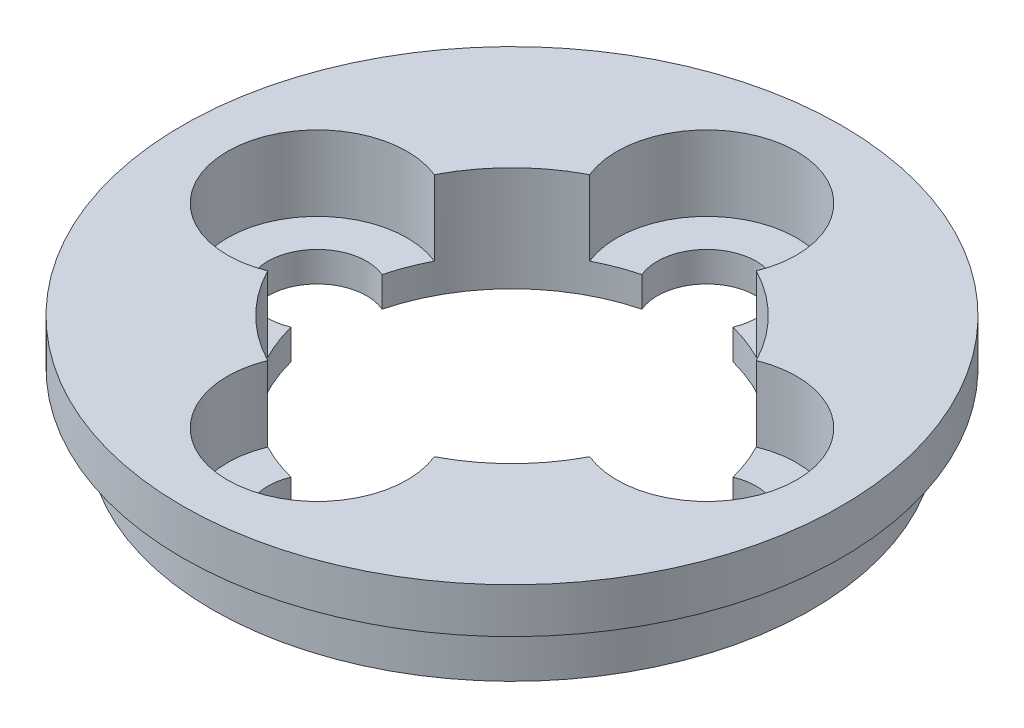
ISO-10303-21;
HEADER;
FILE_DESCRIPTION(('STEP AP214'),'2;1');
FILE_NAME('part.step','',(''),(''),'','','');
FILE_SCHEMA(('AUTOMOTIVE_DESIGN { 1 0 10303 214 1 1 1 1 }'));
ENDSEC;
DATA;
#1=APPLICATION_CONTEXT('core data for automotive mechanical design processes');
#2=APPLICATION_PROTOCOL_DEFINITION('international standard','automotive_design',2000,#1);
#3=PRODUCT_CONTEXT('',#1,'mechanical');
#4=PRODUCT('Part','Part','',(#3));
#5=PRODUCT_RELATED_PRODUCT_CATEGORY('part','',(#4));
#6=PRODUCT_DEFINITION_FORMATION('','',#4);
#7=PRODUCT_DEFINITION_CONTEXT('part definition',#1,'design');
#8=PRODUCT_DEFINITION('design','',#6,#7);
#9=PRODUCT_DEFINITION_SHAPE('','',#8);
#10=(LENGTH_UNIT() NAMED_UNIT(*) SI_UNIT(.MILLI.,.METRE.));
#11=(NAMED_UNIT(*) PLANE_ANGLE_UNIT() SI_UNIT($,.RADIAN.));
#12=(NAMED_UNIT(*) SI_UNIT($,.STERADIAN.) SOLID_ANGLE_UNIT());
#13=UNCERTAINTY_MEASURE_WITH_UNIT(LENGTH_MEASURE(1.E-05),#10,'distance_accuracy_value','');
#14=(GEOMETRIC_REPRESENTATION_CONTEXT(3) GLOBAL_UNCERTAINTY_ASSIGNED_CONTEXT((#13)) GLOBAL_UNIT_ASSIGNED_CONTEXT((#10,
#11,#12)) REPRESENTATION_CONTEXT('',''));
#15=CARTESIAN_POINT('',(0.,0.,0.));
#16=DIRECTION('',(0.,0.,1.));
#17=DIRECTION('',(1.,0.,0.));
#18=AXIS2_PLACEMENT_3D('',#15,#16,#17);
#19=CARTESIAN_POINT('',(0.,0.,-6.5));
#20=DIRECTION('',(0.,1.,0.));
#21=DIRECTION('',(0.,0.,1.));
#22=AXIS2_PLACEMENT_3D('',#19,#20,#21);
#23=CYLINDRICAL_SURFACE('',#22,1.65);
#24=CARTESIAN_POINT('',(0.,1.,-6.5));
#25=DIRECTION('',(0.,1.,0.));
#26=DIRECTION('',(0.,0.,1.));
#27=AXIS2_PLACEMENT_3D('',#24,#25,#26);
#28=CIRCLE('',#27,1.65);
#29=CARTESIAN_POINT('',(-1.51919785748194,1.,-5.85615384615383));
#30=VERTEX_POINT('',#29);
#31=CARTESIAN_POINT('',(1.51919785748181,1.,-5.85615384615386));
#32=VERTEX_POINT('',#31);
#33=EDGE_CURVE('E11',#30,#32,#28,.F.);
#34=ORIENTED_EDGE('',*,*,#33,.F.);
#35=DIRECTION('',(0.,1.,0.));
#36=VECTOR('',#35,1.);
#37=CARTESIAN_POINT('',(-1.51919785748194,1.,-5.85615384615383));
#38=LINE('',#37,#36);
#39=CARTESIAN_POINT('',(-1.51919785748194,0.,-5.85615384615383));
#40=VERTEX_POINT('',#39);
#41=EDGE_CURVE('E248',#30,#40,#38,.F.);
#42=ORIENTED_EDGE('',*,*,#41,.T.);
#43=CARTESIAN_POINT('',(0.,0.,-6.5));
#44=DIRECTION('',(0.,1.,0.));
#45=DIRECTION('',(-1.,0.,0.));
#46=AXIS2_PLACEMENT_3D('',#43,#44,#45);
#47=CIRCLE('',#46,1.65);
#48=CARTESIAN_POINT('',(1.51919785748181,0.,-5.85615384615386));
#49=VERTEX_POINT('',#48);
#50=EDGE_CURVE('E218',#49,#40,#47,.T.);
#51=ORIENTED_EDGE('',*,*,#50,.F.);
#52=DIRECTION('',(0.,1.,0.));
#53=VECTOR('',#52,1.);
#54=CARTESIAN_POINT('',(1.51919785748181,1.,-5.85615384615386));
#55=LINE('',#54,#53);
#56=EDGE_CURVE('E250',#49,#32,#55,.T.);
#57=ORIENTED_EDGE('',*,*,#56,.T.);
#58=EDGE_LOOP('',(#34,#42,#51,#57));
#59=FACE_BOUND('',#58,.T.);
#60=ADVANCED_FACE('F37',(#59),#23,.F.);
#61=CARTESIAN_POINT('',(6.5,0.,0.));
#62=DIRECTION('',(0.,1.,0.));
#63=DIRECTION('',(0.,0.,1.));
#64=AXIS2_PLACEMENT_3D('',#61,#62,#63);
#65=CYLINDRICAL_SURFACE('',#64,1.65);
#66=CARTESIAN_POINT('',(6.5,1.,0.));
#67=DIRECTION('',(0.,1.,0.));
#68=DIRECTION('',(0.,0.,1.));
#69=AXIS2_PLACEMENT_3D('',#66,#67,#68);
#70=CIRCLE('',#69,1.65);
#71=CARTESIAN_POINT('',(5.85615384615385,1.,-1.51919785748187));
#72=VERTEX_POINT('',#71);
#73=CARTESIAN_POINT('',(5.85615384615384,1.,1.51919785748187));
#74=VERTEX_POINT('',#73);
#75=EDGE_CURVE('E45',#72,#74,#70,.F.);
#76=ORIENTED_EDGE('',*,*,#75,.F.);
#77=DIRECTION('',(0.,1.,0.));
#78=VECTOR('',#77,1.);
#79=CARTESIAN_POINT('',(5.85615384615385,1.,-1.51919785748187));
#80=LINE('',#79,#78);
#81=CARTESIAN_POINT('',(5.85615384615385,0.,-1.51919785748187));
#82=VERTEX_POINT('',#81);
#83=EDGE_CURVE('E253',#72,#82,#80,.F.);
#84=ORIENTED_EDGE('',*,*,#83,.T.);
#85=CARTESIAN_POINT('',(6.5,0.,0.));
#86=DIRECTION('',(0.,1.,0.));
#87=DIRECTION('',(0.,0.,-1.));
#88=AXIS2_PLACEMENT_3D('',#85,#86,#87);
#89=CIRCLE('',#88,1.65);
#90=CARTESIAN_POINT('',(5.85615384615385,0.,1.51919785748187));
#91=VERTEX_POINT('',#90);
#92=EDGE_CURVE('E225',#91,#82,#89,.T.);
#93=ORIENTED_EDGE('',*,*,#92,.F.);
#94=DIRECTION('',(0.,1.,0.));
#95=VECTOR('',#94,1.);
#96=CARTESIAN_POINT('',(5.85615384615385,1.,1.51919785748187));
#97=LINE('',#96,#95);
#98=EDGE_CURVE('E255',#91,#74,#97,.T.);
#99=ORIENTED_EDGE('',*,*,#98,.T.);
#100=EDGE_LOOP('',(#76,#84,#93,#99));
#101=FACE_BOUND('',#100,.T.);
#102=ADVANCED_FACE('F281',(#101),#65,.F.);
#103=CARTESIAN_POINT('',(0.,0.,6.5));
#104=DIRECTION('',(0.,1.,0.));
#105=DIRECTION('',(0.,0.,1.));
#106=AXIS2_PLACEMENT_3D('',#103,#104,#105);
#107=CYLINDRICAL_SURFACE('',#106,1.65);
#108=CARTESIAN_POINT('',(0.,1.,6.5));
#109=DIRECTION('',(0.,1.,0.));
#110=DIRECTION('',(0.,0.,1.));
#111=AXIS2_PLACEMENT_3D('',#108,#109,#110);
#112=CIRCLE('',#111,1.65);
#113=CARTESIAN_POINT('',(1.51919785748189,1.,5.85615384615384));
#114=VERTEX_POINT('',#113);
#115=CARTESIAN_POINT('',(-1.51919785748185,1.,5.85615384615385));
#116=VERTEX_POINT('',#115);
#117=EDGE_CURVE('E272',#114,#116,#112,.F.);
#118=ORIENTED_EDGE('',*,*,#117,.F.);
#119=DIRECTION('',(0.,1.,0.));
#120=VECTOR('',#119,1.);
#121=CARTESIAN_POINT('',(1.51919785748189,1.,5.85615384615384));
#122=LINE('',#121,#120);
#123=CARTESIAN_POINT('',(1.51919785748189,0.,5.85615384615384));
#124=VERTEX_POINT('',#123);
#125=EDGE_CURVE('E171',#114,#124,#122,.F.);
#126=ORIENTED_EDGE('',*,*,#125,.T.);
#127=CARTESIAN_POINT('',(0.,0.,6.5));
#128=DIRECTION('',(0.,1.,0.));
#129=DIRECTION('',(1.,0.,0.));
#130=AXIS2_PLACEMENT_3D('',#127,#128,#129);
#131=CIRCLE('',#130,1.65);
#132=CARTESIAN_POINT('',(-1.51919785748185,0.,5.85615384615385));
#133=VERTEX_POINT('',#132);
#134=EDGE_CURVE('E221',#133,#124,#131,.T.);
#135=ORIENTED_EDGE('',*,*,#134,.F.);
#136=DIRECTION('',(0.,1.,0.));
#137=VECTOR('',#136,1.);
#138=CARTESIAN_POINT('',(-1.51919785748185,1.,5.85615384615385));
#139=LINE('',#138,#137);
#140=EDGE_CURVE('E259',#133,#116,#139,.T.);
#141=ORIENTED_EDGE('',*,*,#140,.T.);
#142=EDGE_LOOP('',(#118,#126,#135,#141));
#143=FACE_BOUND('',#142,.T.);
#144=ADVANCED_FACE('F317',(#143),#107,.F.);
#145=CARTESIAN_POINT('',(-6.5,0.,0.));
#146=DIRECTION('',(0.,1.,0.));
#147=DIRECTION('',(0.,0.,1.));
#148=AXIS2_PLACEMENT_3D('',#145,#146,#147);
#149=CYLINDRICAL_SURFACE('',#148,1.65);
#150=CARTESIAN_POINT('',(-6.5,1.,0.));
#151=DIRECTION('',(0.,1.,0.));
#152=DIRECTION('',(0.,0.,1.));
#153=AXIS2_PLACEMENT_3D('',#150,#151,#152);
#154=CIRCLE('',#153,1.65);
#155=CARTESIAN_POINT('',(-5.85615384615385,1.,1.51919785748187));
#156=VERTEX_POINT('',#155);
#157=CARTESIAN_POINT('',(-5.85615384615385,1.,-1.51919785748187));
#158=VERTEX_POINT('',#157);
#159=EDGE_CURVE('E265',#156,#158,#154,.F.);
#160=ORIENTED_EDGE('',*,*,#159,.F.);
#161=DIRECTION('',(0.,1.,0.));
#162=VECTOR('',#161,1.);
#163=CARTESIAN_POINT('',(-5.85615384615385,1.,1.51919785748187));
#164=LINE('',#163,#162);
#165=CARTESIAN_POINT('',(-5.85615384615385,0.,1.51919785748187));
#166=VERTEX_POINT('',#165);
#167=EDGE_CURVE('E241',#156,#166,#164,.F.);
#168=ORIENTED_EDGE('',*,*,#167,.T.);
#169=CARTESIAN_POINT('',(-6.5,0.,0.));
#170=DIRECTION('',(0.,1.,0.));
#171=DIRECTION('',(0.,0.,1.));
#172=AXIS2_PLACEMENT_3D('',#169,#170,#171);
#173=CIRCLE('',#172,1.65);
#174=CARTESIAN_POINT('',(-5.85615384615385,0.,-1.51919785748187));
#175=VERTEX_POINT('',#174);
#176=EDGE_CURVE('E224',#175,#166,#173,.T.);
#177=ORIENTED_EDGE('',*,*,#176,.F.);
#178=DIRECTION('',(0.,1.,0.));
#179=VECTOR('',#178,1.);
#180=CARTESIAN_POINT('',(-5.85615384615385,1.,-1.51919785748187));
#181=LINE('',#180,#179);
#182=EDGE_CURVE('E245',#175,#158,#181,.T.);
#183=ORIENTED_EDGE('',*,*,#182,.T.);
#184=EDGE_LOOP('',(#160,#168,#177,#183));
#185=FACE_BOUND('',#184,.T.);
#186=ADVANCED_FACE('F299',(#185),#149,.F.);
#187=CARTESIAN_POINT('',(0.,2.,0.));
#188=DIRECTION('',(0.,-1.,0.));
#189=DIRECTION('',(0.,0.,-1.));
#190=AXIS2_PLACEMENT_3D('',#187,#188,#189);
#191=CYLINDRICAL_SURFACE('',#190,6.05);
#192=DIRECTION('',(0.,1.,0.));
#193=VECTOR('',#192,1.);
#194=CARTESIAN_POINT('',(-2.7803736751863,2.25,5.3732692307692));
#195=LINE('',#194,#193);
#196=CARTESIAN_POINT('',(-2.7803736751863,1.,5.3732692307692));
#197=VERTEX_POINT('',#196);
#198=CARTESIAN_POINT('',(-2.7803736751863,3.5,5.3732692307692));
#199=VERTEX_POINT('',#198);
#200=EDGE_CURVE('E52',#197,#199,#195,.T.);
#201=ORIENTED_EDGE('',*,*,#200,.F.);
#202=CARTESIAN_POINT('',(0.,1.,0.));
#203=DIRECTION('',(0.,1.,0.));
#204=DIRECTION('',(0.,0.,1.));
#205=AXIS2_PLACEMENT_3D('',#202,#203,#204);
#206=CIRCLE('',#205,6.05);
#207=EDGE_CURVE('E165',#197,#116,#206,.T.);
#208=ORIENTED_EDGE('',*,*,#207,.T.);
#209=ORIENTED_EDGE('',*,*,#140,.F.);
#210=CARTESIAN_POINT('',(0.,0.,0.));
#211=DIRECTION('',(0.,1.,0.));
#212=DIRECTION('',(0.,0.,1.));
#213=AXIS2_PLACEMENT_3D('',#210,#211,#212);
#214=CIRCLE('',#213,6.05);
#215=EDGE_CURVE('E233',#166,#133,#214,.T.);
#216=ORIENTED_EDGE('',*,*,#215,.F.);
#217=ORIENTED_EDGE('',*,*,#167,.F.);
#218=CARTESIAN_POINT('',(0.,1.,0.));
#219=DIRECTION('',(0.,1.,0.));
#220=DIRECTION('',(0.,0.,1.));
#221=AXIS2_PLACEMENT_3D('',#218,#219,#220);
#222=CIRCLE('',#221,6.05);
#223=CARTESIAN_POINT('',(-5.37326923076923,1.,2.78037367518624));
#224=VERTEX_POINT('',#223);
#225=EDGE_CURVE('E201',#156,#224,#222,.T.);
#226=ORIENTED_EDGE('',*,*,#225,.T.);
#227=DIRECTION('',(0.,1.,0.));
#228=VECTOR('',#227,1.);
#229=CARTESIAN_POINT('',(-5.37326923076923,2.25,2.78037367518624));
#230=LINE('',#229,#228);
#231=CARTESIAN_POINT('',(-5.37326923076923,3.5,2.78037367518624));
#232=VERTEX_POINT('',#231);
#233=EDGE_CURVE('E196',#232,#224,#230,.F.);
#234=ORIENTED_EDGE('',*,*,#233,.F.);
#235=CARTESIAN_POINT('',(0.,3.5,0.));
#236=DIRECTION('',(0.,1.,0.));
#237=DIRECTION('',(0.,0.,1.));
#238=AXIS2_PLACEMENT_3D('',#235,#236,#237);
#239=CIRCLE('',#238,6.05);
#240=EDGE_CURVE('E207',#199,#232,#239,.F.);
#241=ORIENTED_EDGE('',*,*,#240,.F.);
#242=EDGE_LOOP('',(#201,#208,#209,#216,#217,#226,#234,#241));
#243=FACE_BOUND('',#242,.T.);
#244=ADVANCED_FACE('F314',(#243),#191,.F.);
#245=DIRECTION('',(0.,1.,0.));
#246=VECTOR('',#245,1.);
#247=CARTESIAN_POINT('',(5.37326923076923,2.25,2.78037367518624));
#248=LINE('',#247,#246);
#249=CARTESIAN_POINT('',(5.37326923076923,1.,2.78037367518624));
#250=VERTEX_POINT('',#249);
#251=CARTESIAN_POINT('',(5.37326923076923,3.5,2.78037367518624));
#252=VERTEX_POINT('',#251);
#253=EDGE_CURVE('E60',#250,#252,#248,.T.);
#254=ORIENTED_EDGE('',*,*,#253,.F.);
#255=CARTESIAN_POINT('',(0.,1.,0.));
#256=DIRECTION('',(0.,1.,0.));
#257=DIRECTION('',(0.,0.,1.));
#258=AXIS2_PLACEMENT_3D('',#255,#256,#257);
#259=CIRCLE('',#258,6.05);
#260=EDGE_CURVE('E182',#250,#74,#259,.T.);
#261=ORIENTED_EDGE('',*,*,#260,.T.);
#262=ORIENTED_EDGE('',*,*,#98,.F.);
#263=EDGE_CURVE('E237',#124,#91,#214,.T.);
#264=ORIENTED_EDGE('',*,*,#263,.F.);
#265=ORIENTED_EDGE('',*,*,#125,.F.);
#266=CARTESIAN_POINT('',(0.,1.,0.));
#267=DIRECTION('',(0.,1.,0.));
#268=DIRECTION('',(0.,0.,1.));
#269=AXIS2_PLACEMENT_3D('',#266,#267,#268);
#270=CIRCLE('',#269,6.05);
#271=CARTESIAN_POINT('',(2.78037367518618,1.,5.37326923076926));
#272=VERTEX_POINT('',#271);
#273=EDGE_CURVE('E162',#114,#272,#270,.T.);
#274=ORIENTED_EDGE('',*,*,#273,.T.);
#275=DIRECTION('',(0.,1.,0.));
#276=VECTOR('',#275,1.);
#277=CARTESIAN_POINT('',(2.78037367518618,2.25,5.37326923076926));
#278=LINE('',#277,#276);
#279=CARTESIAN_POINT('',(2.78037367518618,3.5,5.37326923076926));
#280=VERTEX_POINT('',#279);
#281=EDGE_CURVE('E149',#280,#272,#278,.F.);
#282=ORIENTED_EDGE('',*,*,#281,.F.);
#283=CARTESIAN_POINT('',(0.,3.5,0.));
#284=DIRECTION('',(0.,1.,0.));
#285=DIRECTION('',(0.,0.,1.));
#286=AXIS2_PLACEMENT_3D('',#283,#284,#285);
#287=CIRCLE('',#286,6.05);
#288=EDGE_CURVE('E205',#252,#280,#287,.F.);
#289=ORIENTED_EDGE('',*,*,#288,.F.);
#290=EDGE_LOOP('',(#254,#261,#262,#264,#265,#274,#282,#289));
#291=FACE_BOUND('',#290,.T.);
#292=ADVANCED_FACE('F169',(#291),#191,.F.);
#293=DIRECTION('',(0.,1.,0.));
#294=VECTOR('',#293,1.);
#295=CARTESIAN_POINT('',(2.78037367518626,2.25,-5.37326923076922));
#296=LINE('',#295,#294);
#297=CARTESIAN_POINT('',(2.78037367518626,1.,-5.37326923076922));
#298=VERTEX_POINT('',#297);
#299=CARTESIAN_POINT('',(2.78037367518626,3.5,-5.37326923076922));
#300=VERTEX_POINT('',#299);
#301=EDGE_CURVE('E172',#298,#300,#296,.T.);
#302=ORIENTED_EDGE('',*,*,#301,.F.);
#303=CARTESIAN_POINT('',(0.,1.,0.));
#304=DIRECTION('',(0.,1.,0.));
#305=DIRECTION('',(0.,0.,1.));
#306=AXIS2_PLACEMENT_3D('',#303,#304,#305);
#307=CIRCLE('',#306,6.05);
#308=EDGE_CURVE('E188',#298,#32,#307,.T.);
#309=ORIENTED_EDGE('',*,*,#308,.T.);
#310=ORIENTED_EDGE('',*,*,#56,.F.);
#311=EDGE_CURVE('E286',#82,#49,#214,.T.);
#312=ORIENTED_EDGE('',*,*,#311,.F.);
#313=ORIENTED_EDGE('',*,*,#83,.F.);
#314=CARTESIAN_POINT('',(0.,1.,0.));
#315=DIRECTION('',(0.,1.,0.));
#316=DIRECTION('',(0.,0.,1.));
#317=AXIS2_PLACEMENT_3D('',#314,#315,#316);
#318=CIRCLE('',#317,6.05);
#319=CARTESIAN_POINT('',(5.37326923076923,1.,-2.78037367518624));
#320=VERTEX_POINT('',#319);
#321=EDGE_CURVE('E174',#72,#320,#318,.T.);
#322=ORIENTED_EDGE('',*,*,#321,.T.);
#323=DIRECTION('',(0.,1.,0.));
#324=VECTOR('',#323,1.);
#325=CARTESIAN_POINT('',(5.37326923076923,2.25,-2.78037367518624));
#326=LINE('',#325,#324);
#327=CARTESIAN_POINT('',(5.37326923076923,3.5,-2.78037367518624));
#328=VERTEX_POINT('',#327);
#329=EDGE_CURVE('E318',#328,#320,#326,.F.);
#330=ORIENTED_EDGE('',*,*,#329,.F.);
#331=CARTESIAN_POINT('',(0.,3.5,0.));
#332=DIRECTION('',(0.,1.,0.));
#333=DIRECTION('',(0.,0.,1.));
#334=AXIS2_PLACEMENT_3D('',#331,#332,#333);
#335=CIRCLE('',#334,6.05);
#336=EDGE_CURVE('E212',#300,#328,#335,.F.);
#337=ORIENTED_EDGE('',*,*,#336,.F.);
#338=EDGE_LOOP('',(#302,#309,#310,#312,#313,#322,#330,#337));
#339=FACE_BOUND('',#338,.T.);
#340=ADVANCED_FACE('F290',(#339),#191,.F.);
#341=CARTESIAN_POINT('',(0.,0.,0.));
#342=DIRECTION('',(0.,1.,0.));
#343=DIRECTION('',(0.,0.,1.));
#344=AXIS2_PLACEMENT_3D('',#341,#342,#343);
#345=PLANE('',#344);
#346=CARTESIAN_POINT('',(0.,0.,0.));
#347=DIRECTION('',(0.,1.,0.));
#348=DIRECTION('',(0.,0.,1.));
#349=AXIS2_PLACEMENT_3D('',#346,#347,#348);
#350=CIRCLE('',#349,10.);
#351=CARTESIAN_POINT('',(0.,0.,10.));
#352=VERTEX_POINT('',#351);
#353=EDGE_CURVE('E236',#352,#352,#350,.T.);
#354=ORIENTED_EDGE('',*,*,#353,.F.);
#355=EDGE_LOOP('',(#354));
#356=FACE_BOUND('',#355,.T.);
#357=ORIENTED_EDGE('',*,*,#215,.T.);
#358=ORIENTED_EDGE('',*,*,#134,.T.);
#359=ORIENTED_EDGE('',*,*,#263,.T.);
#360=ORIENTED_EDGE('',*,*,#92,.T.);
#361=ORIENTED_EDGE('',*,*,#311,.T.);
#362=ORIENTED_EDGE('',*,*,#50,.T.);
#363=EDGE_CURVE('E232',#40,#175,#214,.T.);
#364=ORIENTED_EDGE('',*,*,#363,.T.);
#365=ORIENTED_EDGE('',*,*,#176,.T.);
#366=EDGE_LOOP('',(#357,#358,#359,#360,#361,#362,#364,#365));
#367=FACE_BOUND('',#366,.T.);
#368=ADVANCED_FACE('F285',(#356,#367),#345,.F.);
#369=CARTESIAN_POINT('',(0.,2.,0.));
#370=DIRECTION('',(0.,-1.,0.));
#371=DIRECTION('',(0.,0.,-1.));
#372=AXIS2_PLACEMENT_3D('',#369,#370,#371);
#373=CYLINDRICAL_SURFACE('',#372,10.);
#374=CARTESIAN_POINT('',(0.,2.,0.));
#375=DIRECTION('',(0.,1.,0.));
#376=DIRECTION('',(0.,0.,1.));
#377=AXIS2_PLACEMENT_3D('',#374,#375,#376);
#378=CIRCLE('',#377,10.);
#379=CARTESIAN_POINT('',(0.,2.,10.));
#380=VERTEX_POINT('',#379);
#381=EDGE_CURVE('E238',#380,#380,#378,.T.);
#382=ORIENTED_EDGE('',*,*,#381,.F.);
#383=EDGE_LOOP('',(#382));
#384=FACE_BOUND('',#383,.T.);
#385=ORIENTED_EDGE('',*,*,#353,.T.);
#386=EDGE_LOOP('',(#385));
#387=FACE_BOUND('',#386,.T.);
#388=ADVANCED_FACE('F39',(#384,#387),#373,.T.);
#389=DIRECTION('',(0.,1.,0.));
#390=VECTOR('',#389,1.);
#391=CARTESIAN_POINT('',(-2.78037367518622,2.25,-5.37326923076924));
#392=LINE('',#391,#390);
#393=CARTESIAN_POINT('',(-2.78037367518622,3.5,-5.37326923076924));
#394=VERTEX_POINT('',#393);
#395=CARTESIAN_POINT('',(-2.78037367518622,1.,-5.37326923076924));
#396=VERTEX_POINT('',#395);
#397=EDGE_CURVE('E176',#394,#396,#392,.F.);
#398=ORIENTED_EDGE('',*,*,#397,.F.);
#399=CARTESIAN_POINT('',(0.,3.5,0.));
#400=DIRECTION('',(0.,1.,0.));
#401=DIRECTION('',(0.,0.,1.));
#402=AXIS2_PLACEMENT_3D('',#399,#400,#401);
#403=CIRCLE('',#402,6.05);
#404=CARTESIAN_POINT('',(-5.37326923076923,3.5,-2.78037367518624));
#405=VERTEX_POINT('',#404);
#406=EDGE_CURVE('E209',#405,#394,#403,.F.);
#407=ORIENTED_EDGE('',*,*,#406,.F.);
#408=DIRECTION('',(0.,1.,0.));
#409=VECTOR('',#408,1.);
#410=CARTESIAN_POINT('',(-5.37326923076923,2.25,-2.78037367518624));
#411=LINE('',#410,#409);
#412=CARTESIAN_POINT('',(-5.37326923076923,1.,-2.78037367518624));
#413=VERTEX_POINT('',#412);
#414=EDGE_CURVE('E194',#413,#405,#411,.T.);
#415=ORIENTED_EDGE('',*,*,#414,.F.);
#416=CARTESIAN_POINT('',(0.,1.,0.));
#417=DIRECTION('',(0.,1.,0.));
#418=DIRECTION('',(0.,0.,1.));
#419=AXIS2_PLACEMENT_3D('',#416,#417,#418);
#420=CIRCLE('',#419,6.05);
#421=EDGE_CURVE('E198',#413,#158,#420,.T.);
#422=ORIENTED_EDGE('',*,*,#421,.T.);
#423=ORIENTED_EDGE('',*,*,#182,.F.);
#424=ORIENTED_EDGE('',*,*,#363,.F.);
#425=ORIENTED_EDGE('',*,*,#41,.F.);
#426=CARTESIAN_POINT('',(0.,1.,0.));
#427=DIRECTION('',(0.,1.,0.));
#428=DIRECTION('',(0.,0.,1.));
#429=AXIS2_PLACEMENT_3D('',#426,#427,#428);
#430=CIRCLE('',#429,6.05);
#431=EDGE_CURVE('E185',#30,#396,#430,.T.);
#432=ORIENTED_EDGE('',*,*,#431,.T.);
#433=EDGE_LOOP('',(#398,#407,#415,#422,#423,#424,#425,#432));
#434=FACE_BOUND('',#433,.T.);
#435=ADVANCED_FACE('F302',(#434),#191,.F.);
#436=CARTESIAN_POINT('',(0.,3.5,0.));
#437=DIRECTION('',(0.,-1.,0.));
#438=DIRECTION('',(0.,0.,-1.));
#439=AXIS2_PLACEMENT_3D('',#436,#437,#438);
#440=CYLINDRICAL_SURFACE('',#439,11.);
#441=CARTESIAN_POINT('',(0.,3.5,0.));
#442=DIRECTION('',(0.,1.,0.));
#443=DIRECTION('',(0.,0.,1.));
#444=AXIS2_PLACEMENT_3D('',#441,#442,#443);
#445=CIRCLE('',#444,11.);
#446=CARTESIAN_POINT('',(0.,3.5,11.));
#447=VERTEX_POINT('',#446);
#448=EDGE_CURVE('E215',#447,#447,#445,.T.);
#449=ORIENTED_EDGE('',*,*,#448,.F.);
#450=EDGE_LOOP('',(#449));
#451=FACE_BOUND('',#450,.T.);
#452=CARTESIAN_POINT('',(0.,2.,0.));
#453=DIRECTION('',(0.,1.,0.));
#454=DIRECTION('',(0.,0.,1.));
#455=AXIS2_PLACEMENT_3D('',#452,#453,#454);
#456=CIRCLE('',#455,11.);
#457=CARTESIAN_POINT('',(0.,2.,11.));
#458=VERTEX_POINT('',#457);
#459=EDGE_CURVE('E204',#458,#458,#456,.T.);
#460=ORIENTED_EDGE('',*,*,#459,.T.);
#461=EDGE_LOOP('',(#460));
#462=FACE_BOUND('',#461,.T.);
#463=ADVANCED_FACE('F358',(#451,#462),#440,.T.);
#464=CARTESIAN_POINT('',(0.,3.5,0.));
#465=DIRECTION('',(0.,1.,0.));
#466=DIRECTION('',(0.,0.,1.));
#467=AXIS2_PLACEMENT_3D('',#464,#465,#466);
#468=PLANE('',#467);
#469=CARTESIAN_POINT('',(0.,3.5,-6.5));
#470=DIRECTION('',(0.,1.,0.));
#471=DIRECTION('',(0.,0.,1.));
#472=AXIS2_PLACEMENT_3D('',#469,#470,#471);
#473=CIRCLE('',#472,3.);
#474=EDGE_CURVE('E270',#300,#394,#473,.T.);
#475=ORIENTED_EDGE('',*,*,#474,.F.);
#476=ORIENTED_EDGE('',*,*,#336,.T.);
#477=CARTESIAN_POINT('',(6.5,3.5,0.));
#478=DIRECTION('',(0.,1.,0.));
#479=DIRECTION('',(0.,0.,1.));
#480=AXIS2_PLACEMENT_3D('',#477,#478,#479);
#481=CIRCLE('',#480,3.);
#482=EDGE_CURVE('E268',#252,#328,#481,.T.);
#483=ORIENTED_EDGE('',*,*,#482,.F.);
#484=ORIENTED_EDGE('',*,*,#288,.T.);
#485=CARTESIAN_POINT('',(0.,3.5,6.5));
#486=DIRECTION('',(0.,1.,0.));
#487=DIRECTION('',(0.,0.,1.));
#488=AXIS2_PLACEMENT_3D('',#485,#486,#487);
#489=CIRCLE('',#488,3.);
#490=EDGE_CURVE('E153',#199,#280,#489,.T.);
#491=ORIENTED_EDGE('',*,*,#490,.F.);
#492=ORIENTED_EDGE('',*,*,#240,.T.);
#493=CARTESIAN_POINT('',(-6.5,3.5,0.));
#494=DIRECTION('',(0.,1.,0.));
#495=DIRECTION('',(0.,0.,1.));
#496=AXIS2_PLACEMENT_3D('',#493,#494,#495);
#497=CIRCLE('',#496,3.);
#498=EDGE_CURVE('E262',#405,#232,#497,.T.);
#499=ORIENTED_EDGE('',*,*,#498,.F.);
#500=ORIENTED_EDGE('',*,*,#406,.T.);
#501=EDGE_LOOP('',(#475,#476,#483,#484,#491,#492,#499,#500));
#502=FACE_BOUND('',#501,.T.);
#503=ORIENTED_EDGE('',*,*,#448,.T.);
#504=EDGE_LOOP('',(#503));
#505=FACE_BOUND('',#504,.T.);
#506=ADVANCED_FACE('F335',(#502,#505),#468,.T.);
#507=CARTESIAN_POINT('',(0.,2.,0.));
#508=DIRECTION('',(0.,1.,0.));
#509=DIRECTION('',(0.,0.,1.));
#510=AXIS2_PLACEMENT_3D('',#507,#508,#509);
#511=PLANE('',#510);
#512=ORIENTED_EDGE('',*,*,#381,.T.);
#513=EDGE_LOOP('',(#512));
#514=FACE_BOUND('',#513,.T.);
#515=ORIENTED_EDGE('',*,*,#459,.F.);
#516=EDGE_LOOP('',(#515));
#517=FACE_BOUND('',#516,.T.);
#518=ADVANCED_FACE('F415',(#514,#517),#511,.F.);
#519=CARTESIAN_POINT('',(-6.5,1.,0.));
#520=DIRECTION('',(0.,1.,0.));
#521=DIRECTION('',(0.,0.,1.));
#522=AXIS2_PLACEMENT_3D('',#519,#520,#521);
#523=CYLINDRICAL_SURFACE('',#522,3.);
#524=ORIENTED_EDGE('',*,*,#233,.T.);
#525=CARTESIAN_POINT('',(-6.5,1.,0.));
#526=DIRECTION('',(0.,1.,0.));
#527=DIRECTION('',(0.,0.,1.));
#528=AXIS2_PLACEMENT_3D('',#525,#526,#527);
#529=CIRCLE('',#528,3.);
#530=EDGE_CURVE('E191',#413,#224,#529,.T.);
#531=ORIENTED_EDGE('',*,*,#530,.F.);
#532=ORIENTED_EDGE('',*,*,#414,.T.);
#533=ORIENTED_EDGE('',*,*,#498,.T.);
#534=EDGE_LOOP('',(#524,#531,#532,#533));
#535=FACE_BOUND('',#534,.T.);
#536=ADVANCED_FACE('F309',(#535),#523,.F.);
#537=CARTESIAN_POINT('',(-6.5,1.,0.));
#538=DIRECTION('',(0.,1.,0.));
#539=DIRECTION('',(0.,0.,1.));
#540=AXIS2_PLACEMENT_3D('',#537,#538,#539);
#541=PLANE('',#540);
#542=ORIENTED_EDGE('',*,*,#159,.T.);
#543=ORIENTED_EDGE('',*,*,#421,.F.);
#544=ORIENTED_EDGE('',*,*,#530,.T.);
#545=ORIENTED_EDGE('',*,*,#225,.F.);
#546=EDGE_LOOP('',(#542,#543,#544,#545));
#547=FACE_BOUND('',#546,.T.);
#548=ADVANCED_FACE('F307',(#547),#541,.T.);
#549=CARTESIAN_POINT('',(0.,1.,6.5));
#550=DIRECTION('',(0.,1.,0.));
#551=DIRECTION('',(0.,0.,1.));
#552=AXIS2_PLACEMENT_3D('',#549,#550,#551);
#553=CYLINDRICAL_SURFACE('',#552,3.);
#554=ORIENTED_EDGE('',*,*,#200,.T.);
#555=ORIENTED_EDGE('',*,*,#490,.T.);
#556=ORIENTED_EDGE('',*,*,#281,.T.);
#557=CARTESIAN_POINT('',(0.,1.,6.5));
#558=DIRECTION('',(0.,1.,0.));
#559=DIRECTION('',(1.,0.,0.));
#560=AXIS2_PLACEMENT_3D('',#557,#558,#559);
#561=CIRCLE('',#560,3.);
#562=EDGE_CURVE('E152',#197,#272,#561,.T.);
#563=ORIENTED_EDGE('',*,*,#562,.F.);
#564=EDGE_LOOP('',(#554,#555,#556,#563));
#565=FACE_BOUND('',#564,.T.);
#566=ADVANCED_FACE('F151',(#565),#553,.F.);
#567=CARTESIAN_POINT('',(0.,1.,6.5));
#568=DIRECTION('',(0.,1.,0.));
#569=DIRECTION('',(1.,0.,0.));
#570=AXIS2_PLACEMENT_3D('',#567,#568,#569);
#571=PLANE('',#570);
#572=ORIENTED_EDGE('',*,*,#562,.T.);
#573=ORIENTED_EDGE('',*,*,#273,.F.);
#574=ORIENTED_EDGE('',*,*,#117,.T.);
#575=ORIENTED_EDGE('',*,*,#207,.F.);
#576=EDGE_LOOP('',(#572,#573,#574,#575));
#577=FACE_BOUND('',#576,.T.);
#578=ADVANCED_FACE('F161',(#577),#571,.T.);
#579=CARTESIAN_POINT('',(6.5,1.,0.));
#580=DIRECTION('',(0.,1.,0.));
#581=DIRECTION('',(0.,0.,1.));
#582=AXIS2_PLACEMENT_3D('',#579,#580,#581);
#583=CYLINDRICAL_SURFACE('',#582,3.);
#584=ORIENTED_EDGE('',*,*,#253,.T.);
#585=ORIENTED_EDGE('',*,*,#482,.T.);
#586=ORIENTED_EDGE('',*,*,#329,.T.);
#587=CARTESIAN_POINT('',(6.5,1.,0.));
#588=DIRECTION('',(0.,1.,0.));
#589=DIRECTION('',(0.,0.,-1.));
#590=AXIS2_PLACEMENT_3D('',#587,#588,#589);
#591=CIRCLE('',#590,3.);
#592=EDGE_CURVE('E166',#250,#320,#591,.T.);
#593=ORIENTED_EDGE('',*,*,#592,.F.);
#594=EDGE_LOOP('',(#584,#585,#586,#593));
#595=FACE_BOUND('',#594,.T.);
#596=ADVANCED_FACE('F337',(#595),#583,.F.);
#597=CARTESIAN_POINT('',(6.5,1.,0.));
#598=DIRECTION('',(0.,1.,0.));
#599=DIRECTION('',(0.,0.,-1.));
#600=AXIS2_PLACEMENT_3D('',#597,#598,#599);
#601=PLANE('',#600);
#602=ORIENTED_EDGE('',*,*,#592,.T.);
#603=ORIENTED_EDGE('',*,*,#321,.F.);
#604=ORIENTED_EDGE('',*,*,#75,.T.);
#605=ORIENTED_EDGE('',*,*,#260,.F.);
#606=EDGE_LOOP('',(#602,#603,#604,#605));
#607=FACE_BOUND('',#606,.T.);
#608=ADVANCED_FACE('F276',(#607),#601,.T.);
#609=CARTESIAN_POINT('',(0.,1.,-6.5));
#610=DIRECTION('',(0.,1.,0.));
#611=DIRECTION('',(0.,0.,1.));
#612=AXIS2_PLACEMENT_3D('',#609,#610,#611);
#613=CYLINDRICAL_SURFACE('',#612,3.);
#614=ORIENTED_EDGE('',*,*,#301,.T.);
#615=ORIENTED_EDGE('',*,*,#474,.T.);
#616=ORIENTED_EDGE('',*,*,#397,.T.);
#617=CARTESIAN_POINT('',(0.,1.,-6.5));
#618=DIRECTION('',(0.,1.,0.));
#619=DIRECTION('',(-1.,0.,0.));
#620=AXIS2_PLACEMENT_3D('',#617,#618,#619);
#621=CIRCLE('',#620,3.);
#622=EDGE_CURVE('E158',#298,#396,#621,.T.);
#623=ORIENTED_EDGE('',*,*,#622,.F.);
#624=EDGE_LOOP('',(#614,#615,#616,#623));
#625=FACE_BOUND('',#624,.T.);
#626=ADVANCED_FACE('F325',(#625),#613,.F.);
#627=CARTESIAN_POINT('',(0.,1.,-6.5));
#628=DIRECTION('',(0.,1.,0.));
#629=DIRECTION('',(-1.,0.,0.));
#630=AXIS2_PLACEMENT_3D('',#627,#628,#629);
#631=PLANE('',#630);
#632=ORIENTED_EDGE('',*,*,#622,.T.);
#633=ORIENTED_EDGE('',*,*,#431,.F.);
#634=ORIENTED_EDGE('',*,*,#33,.T.);
#635=ORIENTED_EDGE('',*,*,#308,.F.);
#636=EDGE_LOOP('',(#632,#633,#634,#635));
#637=FACE_BOUND('',#636,.T.);
#638=ADVANCED_FACE('F328',(#637),#631,.T.);
#639=CLOSED_SHELL('',(#60,#102,#144,#186,#244,#292,#340,#368,#388,#435,#463,#506,#518,#536,#548,
#566,#578,#596,#608,#626,#638));
#640=MANIFOLD_SOLID_BREP('B2',#639);
#641=ADVANCED_BREP_SHAPE_REPRESENTATION('',(#18,#640),#14);
#642=SHAPE_DEFINITION_REPRESENTATION(#9,#641);
ENDSEC;
END-ISO-10303-21;
